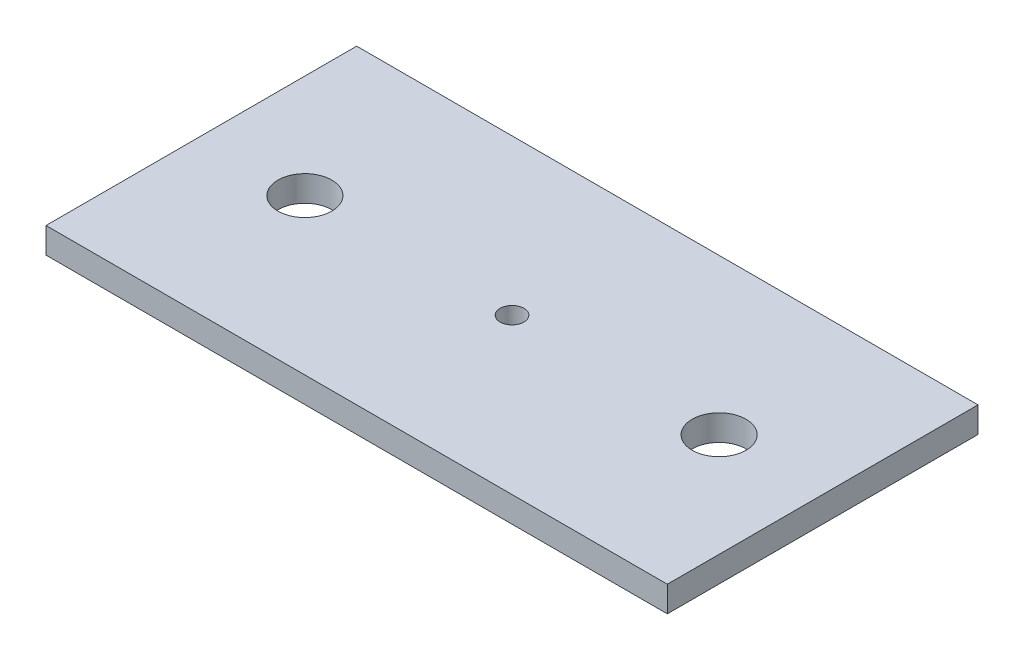
ISO-10303-21;
HEADER;
FILE_DESCRIPTION(('STEP AP214'),'2;1');
FILE_NAME('part.step','',(''),(''),'','','');
FILE_SCHEMA(('AUTOMOTIVE_DESIGN { 1 0 10303 214 1 1 1 1 }'));
ENDSEC;
DATA;
#1=APPLICATION_CONTEXT('core data for automotive mechanical design processes');
#2=APPLICATION_PROTOCOL_DEFINITION('international standard','automotive_design',2000,#1);
#3=PRODUCT_CONTEXT('',#1,'mechanical');
#4=PRODUCT('Part','Part','',(#3));
#5=PRODUCT_RELATED_PRODUCT_CATEGORY('part','',(#4));
#6=PRODUCT_DEFINITION_FORMATION('','',#4);
#7=PRODUCT_DEFINITION_CONTEXT('part definition',#1,'design');
#8=PRODUCT_DEFINITION('design','',#6,#7);
#9=PRODUCT_DEFINITION_SHAPE('','',#8);
#10=(LENGTH_UNIT() NAMED_UNIT(*) SI_UNIT(.MILLI.,.METRE.));
#11=(NAMED_UNIT(*) PLANE_ANGLE_UNIT() SI_UNIT($,.RADIAN.));
#12=(NAMED_UNIT(*) SI_UNIT($,.STERADIAN.) SOLID_ANGLE_UNIT());
#13=UNCERTAINTY_MEASURE_WITH_UNIT(LENGTH_MEASURE(1.E-05),#10,'distance_accuracy_value','');
#14=(GEOMETRIC_REPRESENTATION_CONTEXT(3) GLOBAL_UNCERTAINTY_ASSIGNED_CONTEXT((#13)) GLOBAL_UNIT_ASSIGNED_CONTEXT((#10,
#11,#12)) REPRESENTATION_CONTEXT('',''));
#15=CARTESIAN_POINT('',(0.,0.,0.));
#16=DIRECTION('',(0.,0.,1.));
#17=DIRECTION('',(1.,0.,0.));
#18=AXIS2_PLACEMENT_3D('',#15,#16,#17);
#19=CARTESIAN_POINT('',(0.,3.1496,0.));
#20=DIRECTION('',(1.,0.,0.));
#21=DIRECTION('',(0.,0.,-1.));
#22=AXIS2_PLACEMENT_3D('',#19,#20,#21);
#23=PLANE('',#22);
#24=DIRECTION('',(0.,0.,1.));
#25=VECTOR('',#24,1.);
#26=CARTESIAN_POINT('',(0.,0.,0.));
#27=LINE('',#26,#25);
#28=CARTESIAN_POINT('',(0.,0.,-38.1));
#29=VERTEX_POINT('',#28);
#30=CARTESIAN_POINT('',(0.,0.,0.));
#31=VERTEX_POINT('',#30);
#32=EDGE_CURVE('E105',#29,#31,#27,.T.);
#33=ORIENTED_EDGE('',*,*,#32,.T.);
#34=DIRECTION('',(0.,-1.,0.));
#35=VECTOR('',#34,1.);
#36=CARTESIAN_POINT('',(0.,3.1496,0.));
#37=LINE('',#36,#35);
#38=CARTESIAN_POINT('',(0.,3.1496,0.));
#39=VERTEX_POINT('',#38);
#40=EDGE_CURVE('E11',#39,#31,#37,.T.);
#41=ORIENTED_EDGE('',*,*,#40,.F.);
#42=DIRECTION('',(0.,0.,1.));
#43=VECTOR('',#42,1.);
#44=CARTESIAN_POINT('',(0.,3.1496,0.));
#45=LINE('',#44,#43);
#46=CARTESIAN_POINT('',(0.,3.1496,-38.1));
#47=VERTEX_POINT('',#46);
#48=EDGE_CURVE('E89',#47,#39,#45,.T.);
#49=ORIENTED_EDGE('',*,*,#48,.F.);
#50=DIRECTION('',(0.,-1.,0.));
#51=VECTOR('',#50,1.);
#52=CARTESIAN_POINT('',(0.,3.1496,-38.1));
#53=LINE('',#52,#51);
#54=EDGE_CURVE('E98',#47,#29,#53,.T.);
#55=ORIENTED_EDGE('',*,*,#54,.T.);
#56=EDGE_LOOP('',(#33,#41,#49,#55));
#57=FACE_BOUND('',#56,.T.);
#58=ADVANCED_FACE('F39',(#57),#23,.F.);
#59=CARTESIAN_POINT('',(0.,3.1496,0.));
#60=DIRECTION('',(0.,0.,-1.));
#61=DIRECTION('',(-1.,0.,0.));
#62=AXIS2_PLACEMENT_3D('',#59,#60,#61);
#63=PLANE('',#62);
#64=DIRECTION('',(1.,0.,0.));
#65=VECTOR('',#64,1.);
#66=CARTESIAN_POINT('',(0.,0.,0.));
#67=LINE('',#66,#65);
#68=CARTESIAN_POINT('',(76.2,0.,0.));
#69=VERTEX_POINT('',#68);
#70=EDGE_CURVE('E94',#31,#69,#67,.T.);
#71=ORIENTED_EDGE('',*,*,#70,.T.);
#72=DIRECTION('',(0.,-1.,0.));
#73=VECTOR('',#72,1.);
#74=CARTESIAN_POINT('',(76.2,3.1496,0.));
#75=LINE('',#74,#73);
#76=CARTESIAN_POINT('',(76.2,3.1496,0.));
#77=VERTEX_POINT('',#76);
#78=EDGE_CURVE('E50',#77,#69,#75,.T.);
#79=ORIENTED_EDGE('',*,*,#78,.F.);
#80=DIRECTION('',(1.,0.,0.));
#81=VECTOR('',#80,1.);
#82=CARTESIAN_POINT('',(0.,3.1496,0.));
#83=LINE('',#82,#81);
#84=EDGE_CURVE('E83',#39,#77,#83,.T.);
#85=ORIENTED_EDGE('',*,*,#84,.F.);
#86=ORIENTED_EDGE('',*,*,#40,.T.);
#87=EDGE_LOOP('',(#71,#79,#85,#86));
#88=FACE_BOUND('',#87,.T.);
#89=ADVANCED_FACE('F91',(#88),#63,.F.);
#90=CARTESIAN_POINT('',(76.2,3.1496,0.));
#91=DIRECTION('',(-1.,0.,0.));
#92=DIRECTION('',(0.,0.,1.));
#93=AXIS2_PLACEMENT_3D('',#90,#91,#92);
#94=PLANE('',#93);
#95=DIRECTION('',(0.,0.,-1.));
#96=VECTOR('',#95,1.);
#97=CARTESIAN_POINT('',(76.2,0.,0.));
#98=LINE('',#97,#96);
#99=CARTESIAN_POINT('',(76.2,0.,-38.1));
#100=VERTEX_POINT('',#99);
#101=EDGE_CURVE('E75',#69,#100,#98,.T.);
#102=ORIENTED_EDGE('',*,*,#101,.T.);
#103=DIRECTION('',(0.,-1.,0.));
#104=VECTOR('',#103,1.);
#105=CARTESIAN_POINT('',(76.2,3.1496,-38.1));
#106=LINE('',#105,#104);
#107=CARTESIAN_POINT('',(76.2,3.1496,-38.1));
#108=VERTEX_POINT('',#107);
#109=EDGE_CURVE('E92',#108,#100,#106,.T.);
#110=ORIENTED_EDGE('',*,*,#109,.F.);
#111=DIRECTION('',(0.,0.,-1.));
#112=VECTOR('',#111,1.);
#113=CARTESIAN_POINT('',(76.2,3.1496,0.));
#114=LINE('',#113,#112);
#115=EDGE_CURVE('E86',#77,#108,#114,.T.);
#116=ORIENTED_EDGE('',*,*,#115,.F.);
#117=ORIENTED_EDGE('',*,*,#78,.T.);
#118=EDGE_LOOP('',(#102,#110,#116,#117));
#119=FACE_BOUND('',#118,.T.);
#120=ADVANCED_FACE('F96',(#119),#94,.F.);
#121=CARTESIAN_POINT('',(0.,3.1496,-38.1));
#122=DIRECTION('',(0.,0.,1.));
#123=DIRECTION('',(1.,0.,0.));
#124=AXIS2_PLACEMENT_3D('',#121,#122,#123);
#125=PLANE('',#124);
#126=DIRECTION('',(-1.,0.,0.));
#127=VECTOR('',#126,1.);
#128=CARTESIAN_POINT('',(0.,0.,-38.1));
#129=LINE('',#128,#127);
#130=EDGE_CURVE('E77',#100,#29,#129,.T.);
#131=ORIENTED_EDGE('',*,*,#130,.T.);
#132=ORIENTED_EDGE('',*,*,#54,.F.);
#133=DIRECTION('',(-1.,0.,0.));
#134=VECTOR('',#133,1.);
#135=CARTESIAN_POINT('',(0.,3.1496,-38.1));
#136=LINE('',#135,#134);
#137=EDGE_CURVE('E54',#108,#47,#136,.T.);
#138=ORIENTED_EDGE('',*,*,#137,.F.);
#139=ORIENTED_EDGE('',*,*,#109,.T.);
#140=EDGE_LOOP('',(#131,#132,#138,#139));
#141=FACE_BOUND('',#140,.T.);
#142=ADVANCED_FACE('F109',(#141),#125,.F.);
#143=CARTESIAN_POINT('',(0.,3.1496,0.));
#144=DIRECTION('',(0.,-1.,0.));
#145=DIRECTION('',(0.,0.,-1.));
#146=AXIS2_PLACEMENT_3D('',#143,#144,#145);
#147=PLANE('',#146);
#148=CARTESIAN_POINT('',(12.7,3.1496,-19.05));
#149=DIRECTION('',(0.,1.,0.));
#150=DIRECTION('',(0.,0.,1.));
#151=AXIS2_PLACEMENT_3D('',#148,#149,#150);
#152=CIRCLE('',#151,3.302);
#153=CARTESIAN_POINT('',(12.7,3.1496,-15.748));
#154=VERTEX_POINT('',#153);
#155=EDGE_CURVE('E126',#154,#154,#152,.T.);
#156=ORIENTED_EDGE('',*,*,#155,.F.);
#157=EDGE_LOOP('',(#156));
#158=FACE_BOUND('',#157,.T.);
#159=CARTESIAN_POINT('',(63.5,3.1496,-19.05));
#160=DIRECTION('',(0.,1.,0.));
#161=DIRECTION('',(0.,0.,1.));
#162=AXIS2_PLACEMENT_3D('',#159,#160,#161);
#163=CIRCLE('',#162,3.302);
#164=CARTESIAN_POINT('',(63.5,3.1496,-15.748));
#165=VERTEX_POINT('',#164);
#166=EDGE_CURVE('E123',#165,#165,#163,.T.);
#167=ORIENTED_EDGE('',*,*,#166,.F.);
#168=EDGE_LOOP('',(#167));
#169=FACE_BOUND('',#168,.T.);
#170=CARTESIAN_POINT('',(38.1,3.1496,-19.05));
#171=DIRECTION('',(0.,1.,0.));
#172=DIRECTION('',(0.,0.,1.));
#173=AXIS2_PLACEMENT_3D('',#170,#171,#172);
#174=CIRCLE('',#173,1.4605);
#175=CARTESIAN_POINT('',(38.1,3.1496,-17.5895));
#176=VERTEX_POINT('',#175);
#177=EDGE_CURVE('E120',#176,#176,#174,.T.);
#178=ORIENTED_EDGE('',*,*,#177,.F.);
#179=EDGE_LOOP('',(#178));
#180=FACE_BOUND('',#179,.T.);
#181=ORIENTED_EDGE('',*,*,#48,.T.);
#182=ORIENTED_EDGE('',*,*,#84,.T.);
#183=ORIENTED_EDGE('',*,*,#115,.T.);
#184=ORIENTED_EDGE('',*,*,#137,.T.);
#185=EDGE_LOOP('',(#181,#182,#183,#184));
#186=FACE_BOUND('',#185,.T.);
#187=ADVANCED_FACE('F88',(#158,#169,#180,#186),#147,.F.);
#188=CARTESIAN_POINT('',(0.,0.,0.));
#189=DIRECTION('',(0.,-1.,0.));
#190=DIRECTION('',(0.,0.,-1.));
#191=AXIS2_PLACEMENT_3D('',#188,#189,#190);
#192=PLANE('',#191);
#193=CARTESIAN_POINT('',(12.7,0.,-19.05));
#194=DIRECTION('',(0.,1.,0.));
#195=DIRECTION('',(0.,0.,1.));
#196=AXIS2_PLACEMENT_3D('',#193,#194,#195);
#197=CIRCLE('',#196,3.302);
#198=CARTESIAN_POINT('',(12.7,0.,-15.748));
#199=VERTEX_POINT('',#198);
#200=EDGE_CURVE('E104',#199,#199,#197,.T.);
#201=ORIENTED_EDGE('',*,*,#200,.T.);
#202=EDGE_LOOP('',(#201));
#203=FACE_BOUND('',#202,.T.);
#204=CARTESIAN_POINT('',(63.5,0.,-19.05));
#205=DIRECTION('',(0.,1.,0.));
#206=DIRECTION('',(0.,0.,1.));
#207=AXIS2_PLACEMENT_3D('',#204,#205,#206);
#208=CIRCLE('',#207,3.302);
#209=CARTESIAN_POINT('',(63.5,0.,-15.748));
#210=VERTEX_POINT('',#209);
#211=EDGE_CURVE('E125',#210,#210,#208,.T.);
#212=ORIENTED_EDGE('',*,*,#211,.T.);
#213=EDGE_LOOP('',(#212));
#214=FACE_BOUND('',#213,.T.);
#215=CARTESIAN_POINT('',(38.1,0.,-19.05));
#216=DIRECTION('',(0.,1.,0.));
#217=DIRECTION('',(0.,0.,1.));
#218=AXIS2_PLACEMENT_3D('',#215,#216,#217);
#219=CIRCLE('',#218,1.4605);
#220=CARTESIAN_POINT('',(38.1,0.,-17.5895));
#221=VERTEX_POINT('',#220);
#222=EDGE_CURVE('E118',#221,#221,#219,.T.);
#223=ORIENTED_EDGE('',*,*,#222,.T.);
#224=EDGE_LOOP('',(#223));
#225=FACE_BOUND('',#224,.T.);
#226=ORIENTED_EDGE('',*,*,#32,.F.);
#227=ORIENTED_EDGE('',*,*,#130,.F.);
#228=ORIENTED_EDGE('',*,*,#101,.F.);
#229=ORIENTED_EDGE('',*,*,#70,.F.);
#230=EDGE_LOOP('',(#226,#227,#228,#229));
#231=FACE_BOUND('',#230,.T.);
#232=ADVANCED_FACE('F114',(#203,#214,#225,#231),#192,.T.);
#233=CARTESIAN_POINT('',(38.1,0.,-19.05));
#234=DIRECTION('',(0.,1.,0.));
#235=DIRECTION('',(0.,0.,1.));
#236=AXIS2_PLACEMENT_3D('',#233,#234,#235);
#237=CYLINDRICAL_SURFACE('',#236,1.4605);
#238=ORIENTED_EDGE('',*,*,#222,.F.);
#239=EDGE_LOOP('',(#238));
#240=FACE_BOUND('',#239,.T.);
#241=ORIENTED_EDGE('',*,*,#177,.T.);
#242=EDGE_LOOP('',(#241));
#243=FACE_BOUND('',#242,.T.);
#244=ADVANCED_FACE('F147',(#240,#243),#237,.F.);
#245=CARTESIAN_POINT('',(63.5,0.,-19.05));
#246=DIRECTION('',(0.,1.,0.));
#247=DIRECTION('',(0.,0.,1.));
#248=AXIS2_PLACEMENT_3D('',#245,#246,#247);
#249=CYLINDRICAL_SURFACE('',#248,3.302);
#250=ORIENTED_EDGE('',*,*,#211,.F.);
#251=EDGE_LOOP('',(#250));
#252=FACE_BOUND('',#251,.T.);
#253=ORIENTED_EDGE('',*,*,#166,.T.);
#254=EDGE_LOOP('',(#253));
#255=FACE_BOUND('',#254,.T.);
#256=ADVANCED_FACE('F136',(#252,#255),#249,.F.);
#257=CARTESIAN_POINT('',(12.7,0.,-19.05));
#258=DIRECTION('',(0.,1.,0.));
#259=DIRECTION('',(0.,0.,1.));
#260=AXIS2_PLACEMENT_3D('',#257,#258,#259);
#261=CYLINDRICAL_SURFACE('',#260,3.302);
#262=ORIENTED_EDGE('',*,*,#200,.F.);
#263=EDGE_LOOP('',(#262));
#264=FACE_BOUND('',#263,.T.);
#265=ORIENTED_EDGE('',*,*,#155,.T.);
#266=EDGE_LOOP('',(#265));
#267=FACE_BOUND('',#266,.T.);
#268=ADVANCED_FACE('F137',(#264,#267),#261,.F.);
#269=CLOSED_SHELL('',(#58,#89,#120,#142,#187,#232,#244,#256,#268));
#270=MANIFOLD_SOLID_BREP('B2',#269);
#271=ADVANCED_BREP_SHAPE_REPRESENTATION('',(#18,#270),#14);
#272=SHAPE_DEFINITION_REPRESENTATION(#9,#271);
ENDSEC;
END-ISO-10303-21;
